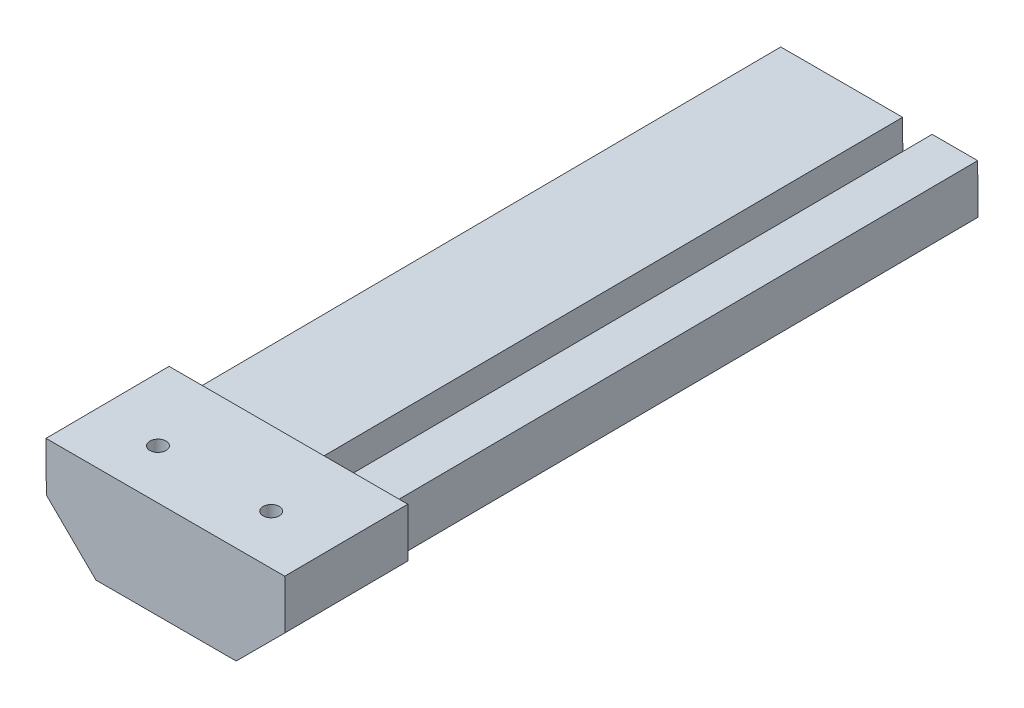
ISO-10303-21;
HEADER;
FILE_DESCRIPTION(('STEP AP214'),'2;1');
FILE_NAME('part.step','',(''),(''),'','','');
FILE_SCHEMA(('AUTOMOTIVE_DESIGN { 1 0 10303 214 1 1 1 1 }'));
ENDSEC;
DATA;
#1=APPLICATION_CONTEXT('core data for automotive mechanical design processes');
#2=APPLICATION_PROTOCOL_DEFINITION('international standard','automotive_design',2000,#1);
#3=PRODUCT_CONTEXT('',#1,'mechanical');
#4=PRODUCT('Part','Part','',(#3));
#5=PRODUCT_RELATED_PRODUCT_CATEGORY('part','',(#4));
#6=PRODUCT_DEFINITION_FORMATION('','',#4);
#7=PRODUCT_DEFINITION_CONTEXT('part definition',#1,'design');
#8=PRODUCT_DEFINITION('design','',#6,#7);
#9=PRODUCT_DEFINITION_SHAPE('','',#8);
#10=(LENGTH_UNIT() NAMED_UNIT(*) SI_UNIT(.MILLI.,.METRE.));
#11=(NAMED_UNIT(*) PLANE_ANGLE_UNIT() SI_UNIT($,.RADIAN.));
#12=(NAMED_UNIT(*) SI_UNIT($,.STERADIAN.) SOLID_ANGLE_UNIT());
#13=UNCERTAINTY_MEASURE_WITH_UNIT(LENGTH_MEASURE(1.E-05),#10,'distance_accuracy_value','');
#14=(GEOMETRIC_REPRESENTATION_CONTEXT(3) GLOBAL_UNCERTAINTY_ASSIGNED_CONTEXT((#13)) GLOBAL_UNIT_ASSIGNED_CONTEXT((#10,
#11,#12)) REPRESENTATION_CONTEXT('',''));
#15=CARTESIAN_POINT('',(0.,0.,0.));
#16=DIRECTION('',(0.,0.,1.));
#17=DIRECTION('',(1.,0.,0.));
#18=AXIS2_PLACEMENT_3D('',#15,#16,#17);
#19=CARTESIAN_POINT('',(12.1004516377429,78.5723158605039,-7605.18042246497));
#20=DIRECTION('',(0.,-0.999977218101321,-0.00675005765475416));
#21=DIRECTION('',(0.,0.00675005765475416,-0.999977218101321));
#22=AXIS2_PLACEMENT_3D('',#19,#20,#21);
#23=PLANE('',#22);
#24=DIRECTION('',(-1.,0.,0.));
#25=VECTOR('',#24,1.);
#26=CARTESIAN_POINT('',(12.1004516377429,78.7410673018727,-7630.1798529175));
#27=LINE('',#26,#25);
#28=CARTESIAN_POINT('',(60.6004516377429,78.7410673018727,-7630.1798529175));
#29=VERTEX_POINT('',#28);
#30=CARTESIAN_POINT('',(12.1004516377429,78.7410673018727,-7630.1798529175));
#31=VERTEX_POINT('',#30);
#32=EDGE_CURVE('E185',#29,#31,#27,.T.);
#33=ORIENTED_EDGE('',*,*,#32,.T.);
#34=DIRECTION('',(0.,0.00675005765475416,-0.999977218101321));
#35=VECTOR('',#34,1.);
#36=CARTESIAN_POINT('',(12.1004516377429,78.5723158605039,-7605.18042246497));
#37=LINE('',#36,#35);
#38=CARTESIAN_POINT('',(12.1004516377429,78.5723158605039,-7605.18042246497));
#39=VERTEX_POINT('',#38);
#40=EDGE_CURVE('E202',#39,#31,#37,.T.);
#41=ORIENTED_EDGE('',*,*,#40,.F.);
#42=DIRECTION('',(-1.,0.,0.));
#43=VECTOR('',#42,1.);
#44=CARTESIAN_POINT('',(12.1004516377429,78.5723158605039,-7605.18042246497));
#45=LINE('',#44,#43);
#46=CARTESIAN_POINT('',(60.6004516377429,78.5723158605039,-7605.18042246497));
#47=VERTEX_POINT('',#46);
#48=EDGE_CURVE('E607',#47,#39,#45,.T.);
#49=ORIENTED_EDGE('',*,*,#48,.F.);
#50=DIRECTION('',(0.,0.00675005765475416,-0.999977218101321));
#51=VECTOR('',#50,1.);
#52=CARTESIAN_POINT('',(60.6004516377429,78.5723158605039,-7605.18042246497));
#53=LINE('',#52,#51);
#54=EDGE_CURVE('E205',#47,#29,#53,.T.);
#55=ORIENTED_EDGE('',*,*,#54,.T.);
#56=EDGE_LOOP('',(#33,#41,#49,#55));
#57=FACE_BOUND('',#56,.T.);
#58=CARTESIAN_POINT('',(24.8504516377429,78.6398164370514,-7615.18019464598));
#59=DIRECTION('',(0.,0.999977218101321,0.00675005765475416));
#60=DIRECTION('',(0.,-0.00675005765475416,0.999977218101321));
#61=AXIS2_PLACEMENT_3D('',#58,#59,#60);
#62=CIRCLE('',#61,1.64999999999999);
#63=CARTESIAN_POINT('',(24.8504516377429,78.6286788419211,-7613.53023223612));
#64=VERTEX_POINT('',#63);
#65=EDGE_CURVE('E192',#64,#64,#62,.T.);
#66=ORIENTED_EDGE('',*,*,#65,.F.);
#67=EDGE_LOOP('',(#66));
#68=FACE_BOUND('',#67,.T.);
#69=CARTESIAN_POINT('',(47.8504516377429,78.6398164370514,-7615.18019464598));
#70=DIRECTION('',(0.,0.999977218101321,0.00675005765475416));
#71=DIRECTION('',(0.,-0.00675005765475416,0.999977218101321));
#72=AXIS2_PLACEMENT_3D('',#69,#70,#71);
#73=CIRCLE('',#72,1.64999999999998);
#74=CARTESIAN_POINT('',(47.8504516377429,78.6286788419211,-7613.53023223612));
#75=VERTEX_POINT('',#74);
#76=EDGE_CURVE('E172',#75,#75,#73,.T.);
#77=ORIENTED_EDGE('',*,*,#76,.F.);
#78=EDGE_LOOP('',(#77));
#79=FACE_BOUND('',#78,.T.);
#80=ADVANCED_FACE('F39',(#57,#68,#79),#23,.F.);
#81=CARTESIAN_POINT('',(1.94161929084201E-11,62.0514729036701,-7750.29524509861));
#82=DIRECTION('',(0.,0.999977218101321,0.00675005765475413));
#83=DIRECTION('',(0.,-0.00675005765475413,0.999977218101321));
#84=AXIS2_PLACEMENT_3D('',#81,#82,#83);
#85=PLANE('',#84);
#86=DIRECTION('',(-1.,0.,0.));
#87=VECTOR('',#86,1.);
#88=CARTESIAN_POINT('',(1.94439481678734E-11,61.2414659850996,-7630.29797892646));
#89=LINE('',#88,#87);
#90=CARTESIAN_POINT('',(44.3504516377429,61.2414659850996,-7630.29797892646));
#91=VERTEX_POINT('',#90);
#92=CARTESIAN_POINT('',(28.3504516377429,61.2414659850996,-7630.29797892646));
#93=VERTEX_POINT('',#92);
#94=EDGE_CURVE('E207',#91,#93,#89,.T.);
#95=ORIENTED_EDGE('',*,*,#94,.T.);
#96=DIRECTION('',(0.,-0.00675005765475413,0.999977218101321));
#97=VECTOR('',#96,1.);
#98=CARTESIAN_POINT('',(28.3504516377429,62.0514729036701,-7750.29524509861));
#99=LINE('',#98,#97);
#100=CARTESIAN_POINT('',(28.3504516377429,62.0514729036701,-7750.29524509861));
#101=VERTEX_POINT('',#100);
#102=EDGE_CURVE('E11',#101,#93,#99,.T.);
#103=ORIENTED_EDGE('',*,*,#102,.F.);
#104=DIRECTION('',(-1.,0.,0.));
#105=VECTOR('',#104,1.);
#106=CARTESIAN_POINT('',(1.94161929084201E-11,62.0514729036701,-7750.29524509861));
#107=LINE('',#106,#105);
#108=CARTESIAN_POINT('',(44.3504516377429,62.0514729036701,-7750.29524509861));
#109=VERTEX_POINT('',#108);
#110=EDGE_CURVE('E208',#109,#101,#107,.T.);
#111=ORIENTED_EDGE('',*,*,#110,.F.);
#112=DIRECTION('',(0.,-0.00675005765475413,0.999977218101321));
#113=VECTOR('',#112,1.);
#114=CARTESIAN_POINT('',(44.3504516377429,62.0514729036701,-7750.29524509861));
#115=LINE('',#114,#113);
#116=EDGE_CURVE('E43',#109,#91,#115,.T.);
#117=ORIENTED_EDGE('',*,*,#116,.T.);
#118=EDGE_LOOP('',(#95,#103,#111,#117));
#119=FACE_BOUND('',#118,.T.);
#120=ADVANCED_FACE('F41',(#119),#85,.F.);
#121=CARTESIAN_POINT('',(28.3504516377429,52.3165751807186,-7750.36095771657));
#122=DIRECTION('',(1.,0.,0.));
#123=DIRECTION('',(0.,1.,0.));
#124=AXIS2_PLACEMENT_3D('',#121,#122,#123);
#125=PLANE('',#124);
#126=DIRECTION('',(0.,0.999977218101321,0.00675005765476218));
#127=VECTOR('',#126,1.);
#128=CARTESIAN_POINT('',(28.3504516377429,51.5065682621481,-7630.36369154441));
#129=LINE('',#128,#127);
#130=CARTESIAN_POINT('',(28.3504516377429,66.2413520756062,-7630.26422863818));
#131=VERTEX_POINT('',#130);
#132=EDGE_CURVE('E212',#93,#131,#129,.T.);
#133=ORIENTED_EDGE('',*,*,#132,.T.);
#134=DIRECTION('',(0.,-0.00675005765475413,0.999977218101321));
#135=VECTOR('',#134,1.);
#136=CARTESIAN_POINT('',(28.3504516377429,67.0513589941767,-7750.26149481034));
#137=LINE('',#136,#135);
#138=CARTESIAN_POINT('',(28.3504516377429,67.0513589941767,-7750.26149481034));
#139=VERTEX_POINT('',#138);
#140=EDGE_CURVE('E48',#139,#131,#137,.T.);
#141=ORIENTED_EDGE('',*,*,#140,.F.);
#142=DIRECTION('',(0.,0.999977218101321,0.00675005765476218));
#143=VECTOR('',#142,1.);
#144=CARTESIAN_POINT('',(28.3504516377429,52.3165751807186,-7750.36095771657));
#145=LINE('',#144,#143);
#146=EDGE_CURVE('E232',#101,#139,#145,.T.);
#147=ORIENTED_EDGE('',*,*,#146,.F.);
#148=ORIENTED_EDGE('',*,*,#102,.T.);
#149=EDGE_LOOP('',(#133,#141,#147,#148));
#150=FACE_BOUND('',#149,.T.);
#151=ADVANCED_FACE('F342',(#150),#125,.F.);
#152=CARTESIAN_POINT('',(1.94173698614288E-11,67.0513589941767,-7750.26149481034));
#153=DIRECTION('',(0.,0.999977218101321,0.00675005765475413));
#154=DIRECTION('',(0.,-0.00675005765475413,0.999977218101321));
#155=AXIS2_PLACEMENT_3D('',#152,#153,#154);
#156=PLANE('',#155);
#157=DIRECTION('',(-1.,0.,0.));
#158=VECTOR('',#157,1.);
#159=CARTESIAN_POINT('',(1.94451251208821E-11,66.2413520756062,-7630.26422863818));
#160=LINE('',#159,#158);
#161=CARTESIAN_POINT('',(16.3504516377429,66.2413520756062,-7630.26422863818));
#162=VERTEX_POINT('',#161);
#163=EDGE_CURVE('E263',#131,#162,#160,.T.);
#164=ORIENTED_EDGE('',*,*,#163,.T.);
#165=DIRECTION('',(0.,-0.00675005765475413,0.999977218101321));
#166=VECTOR('',#165,1.);
#167=CARTESIAN_POINT('',(16.3504516377429,67.0513589941767,-7750.26149481034));
#168=LINE('',#167,#166);
#169=CARTESIAN_POINT('',(16.3504516377429,67.0513589941767,-7750.26149481034));
#170=VERTEX_POINT('',#169);
#171=EDGE_CURVE('E270',#170,#162,#168,.T.);
#172=ORIENTED_EDGE('',*,*,#171,.F.);
#173=DIRECTION('',(-1.,0.,0.));
#174=VECTOR('',#173,1.);
#175=CARTESIAN_POINT('',(1.94173698614288E-11,67.0513589941767,-7750.26149481034));
#176=LINE('',#175,#174);
#177=EDGE_CURVE('E230',#139,#170,#176,.T.);
#178=ORIENTED_EDGE('',*,*,#177,.F.);
#179=ORIENTED_EDGE('',*,*,#140,.T.);
#180=EDGE_LOOP('',(#164,#172,#178,#179));
#181=FACE_BOUND('',#180,.T.);
#182=ADVANCED_FACE('F338',(#181),#156,.F.);
#183=CARTESIAN_POINT('',(16.3504516377429,52.3165751807186,-7750.36095771657));
#184=DIRECTION('',(1.,0.,0.));
#185=DIRECTION('',(0.,1.,0.));
#186=AXIS2_PLACEMENT_3D('',#183,#184,#185);
#187=PLANE('',#186);
#188=DIRECTION('',(0.,0.999977218101321,0.00675005765476218));
#189=VECTOR('',#188,1.);
#190=CARTESIAN_POINT('',(16.3504516377429,51.5065682621481,-7630.36369154441));
#191=LINE('',#190,#189);
#192=CARTESIAN_POINT('',(16.3504516377429,76.2411242566194,-7630.19672806163));
#193=VERTEX_POINT('',#192);
#194=EDGE_CURVE('E260',#162,#193,#191,.T.);
#195=ORIENTED_EDGE('',*,*,#194,.T.);
#196=DIRECTION('',(0.,-0.00675005765475413,0.999977218101321));
#197=VECTOR('',#196,1.);
#198=CARTESIAN_POINT('',(16.3504516377429,77.0511311751899,-7750.19399423379));
#199=LINE('',#198,#197);
#200=CARTESIAN_POINT('',(16.3504516377429,77.0511311751899,-7750.19399423379));
#201=VERTEX_POINT('',#200);
#202=EDGE_CURVE('E273',#201,#193,#199,.T.);
#203=ORIENTED_EDGE('',*,*,#202,.F.);
#204=DIRECTION('',(0.,0.999977218101321,0.00675005765476218));
#205=VECTOR('',#204,1.);
#206=CARTESIAN_POINT('',(16.3504516377429,52.3165751807186,-7750.36095771657));
#207=LINE('',#206,#205);
#208=EDGE_CURVE('E228',#170,#201,#207,.T.);
#209=ORIENTED_EDGE('',*,*,#208,.F.);
#210=ORIENTED_EDGE('',*,*,#171,.T.);
#211=EDGE_LOOP('',(#195,#203,#209,#210));
#212=FACE_BOUND('',#211,.T.);
#213=ADVANCED_FACE('F335',(#212),#187,.F.);
#214=CARTESIAN_POINT('',(1.94197237674463E-11,77.0511311751899,-7750.19399423379));
#215=DIRECTION('',(0.,-0.999977218101321,-0.00675005765475413));
#216=DIRECTION('',(0.,0.00675005765475413,-0.999977218101321));
#217=AXIS2_PLACEMENT_3D('',#214,#215,#216);
#218=PLANE('',#217);
#219=DIRECTION('',(1.,0.,0.));
#220=VECTOR('',#219,1.);
#221=CARTESIAN_POINT('',(1.94474790268995E-11,76.2411242566194,-7630.19672806163));
#222=LINE('',#221,#220);
#223=CARTESIAN_POINT('',(41.1004008377429,76.2411242566194,-7630.19672806163));
#224=VERTEX_POINT('',#223);
#225=EDGE_CURVE('E257',#193,#224,#222,.T.);
#226=ORIENTED_EDGE('',*,*,#225,.T.);
#227=DIRECTION('',(0.,-0.00675005765475413,0.999977218101321));
#228=VECTOR('',#227,1.);
#229=CARTESIAN_POINT('',(41.1004008377429,77.0511311751899,-7750.19399423379));
#230=LINE('',#229,#228);
#231=CARTESIAN_POINT('',(41.1004008377429,77.0511311751899,-7750.19399423379));
#232=VERTEX_POINT('',#231);
#233=EDGE_CURVE('E276',#232,#224,#230,.T.);
#234=ORIENTED_EDGE('',*,*,#233,.F.);
#235=DIRECTION('',(1.,0.,0.));
#236=VECTOR('',#235,1.);
#237=CARTESIAN_POINT('',(1.94197237674463E-11,77.0511311751899,-7750.19399423379));
#238=LINE('',#237,#236);
#239=EDGE_CURVE('E226',#201,#232,#238,.T.);
#240=ORIENTED_EDGE('',*,*,#239,.F.);
#241=ORIENTED_EDGE('',*,*,#202,.T.);
#242=EDGE_LOOP('',(#226,#234,#240,#241));
#243=FACE_BOUND('',#242,.T.);
#244=ADVANCED_FACE('F330',(#243),#218,.F.);
#245=CARTESIAN_POINT('',(41.1004008377414,52.316575180716,-7750.36095771657));
#246=DIRECTION('',(-1.,0.,0.));
#247=DIRECTION('',(0.,-1.,0.));
#248=AXIS2_PLACEMENT_3D('',#245,#246,#247);
#249=PLANE('',#248);
#250=DIRECTION('',(0.,-0.999977218101321,-0.00675005765476218));
#251=VECTOR('',#250,1.);
#252=CARTESIAN_POINT('',(41.1004008377414,51.5065682621455,-7630.36369154441));
#253=LINE('',#252,#251);
#254=CARTESIAN_POINT('',(41.1004008377425,69.2412837299107,-7630.24397846522));
#255=VERTEX_POINT('',#254);
#256=EDGE_CURVE('E254',#224,#255,#253,.T.);
#257=ORIENTED_EDGE('',*,*,#256,.T.);
#258=DIRECTION('',(0.,-0.00675005765475413,0.999977218101321));
#259=VECTOR('',#258,1.);
#260=CARTESIAN_POINT('',(41.1004008377425,70.0512906484812,-7750.24124463738));
#261=LINE('',#260,#259);
#262=CARTESIAN_POINT('',(41.1004008377425,70.0512906484812,-7750.24124463738));
#263=VERTEX_POINT('',#262);
#264=EDGE_CURVE('E279',#263,#255,#261,.T.);
#265=ORIENTED_EDGE('',*,*,#264,.F.);
#266=DIRECTION('',(0.,-0.999977218101321,-0.00675005765476218));
#267=VECTOR('',#266,1.);
#268=CARTESIAN_POINT('',(41.1004008377414,52.316575180716,-7750.36095771657));
#269=LINE('',#268,#267);
#270=EDGE_CURVE('E224',#232,#263,#269,.T.);
#271=ORIENTED_EDGE('',*,*,#270,.F.);
#272=ORIENTED_EDGE('',*,*,#233,.T.);
#273=EDGE_LOOP('',(#257,#265,#271,#272));
#274=FACE_BOUND('',#273,.T.);
#275=ADVANCED_FACE('F327',(#274),#249,.F.);
#276=CARTESIAN_POINT('',(1.94139013527812E-11,70.0512906484812,-7750.24124463738));
#277=DIRECTION('',(0.,-0.999977218101321,-0.00675005765475413));
#278=DIRECTION('',(0.,0.00675005765475413,-0.999977218101321));
#279=AXIS2_PLACEMENT_3D('',#276,#277,#278);
#280=PLANE('',#279);
#281=DIRECTION('',(1.,0.,0.));
#282=VECTOR('',#281,1.);
#283=CARTESIAN_POINT('',(1.94416566122344E-11,69.2412837299107,-7630.24397846522));
#284=LINE('',#283,#282);
#285=CARTESIAN_POINT('',(47.1004008377425,69.2412837299107,-7630.24397846522));
#286=VERTEX_POINT('',#285);
#287=EDGE_CURVE('E251',#255,#286,#284,.T.);
#288=ORIENTED_EDGE('',*,*,#287,.T.);
#289=DIRECTION('',(0.,-0.00675005765475413,0.999977218101321));
#290=VECTOR('',#289,1.);
#291=CARTESIAN_POINT('',(47.1004008377425,70.0512906484812,-7750.24124463738));
#292=LINE('',#291,#290);
#293=CARTESIAN_POINT('',(47.1004008377425,70.0512906484812,-7750.24124463738));
#294=VERTEX_POINT('',#293);
#295=EDGE_CURVE('E282',#294,#286,#292,.T.);
#296=ORIENTED_EDGE('',*,*,#295,.F.);
#297=DIRECTION('',(1.,0.,0.));
#298=VECTOR('',#297,1.);
#299=CARTESIAN_POINT('',(1.94139013527812E-11,70.0512906484812,-7750.24124463738));
#300=LINE('',#299,#298);
#301=EDGE_CURVE('E222',#263,#294,#300,.T.);
#302=ORIENTED_EDGE('',*,*,#301,.F.);
#303=ORIENTED_EDGE('',*,*,#264,.T.);
#304=EDGE_LOOP('',(#288,#296,#302,#303));
#305=FACE_BOUND('',#304,.T.);
#306=ADVANCED_FACE('F322',(#305),#280,.F.);
#307=CARTESIAN_POINT('',(47.1004008377429,52.3165751807186,-7750.36095771657));
#308=DIRECTION('',(1.,0.,0.));
#309=DIRECTION('',(0.,1.,0.));
#310=AXIS2_PLACEMENT_3D('',#307,#308,#309);
#311=PLANE('',#310);
#312=DIRECTION('',(0.,0.999977218101321,0.00675005765476218));
#313=VECTOR('',#312,1.);
#314=CARTESIAN_POINT('',(47.1004008377429,51.5065682621481,-7630.36369154441));
#315=LINE('',#314,#313);
#316=CARTESIAN_POINT('',(47.1004008377429,76.2411242566194,-7630.19672806163));
#317=VERTEX_POINT('',#316);
#318=EDGE_CURVE('E248',#286,#317,#315,.T.);
#319=ORIENTED_EDGE('',*,*,#318,.T.);
#320=DIRECTION('',(0.,-0.00675005765475413,0.999977218101321));
#321=VECTOR('',#320,1.);
#322=CARTESIAN_POINT('',(47.1004008377429,77.0511311751899,-7750.19399423379));
#323=LINE('',#322,#321);
#324=CARTESIAN_POINT('',(47.1004008377429,77.0511311751899,-7750.19399423379));
#325=VERTEX_POINT('',#324);
#326=EDGE_CURVE('E285',#325,#317,#323,.T.);
#327=ORIENTED_EDGE('',*,*,#326,.F.);
#328=DIRECTION('',(0.,0.999977218101321,0.00675005765476218));
#329=VECTOR('',#328,1.);
#330=CARTESIAN_POINT('',(47.1004008377429,52.3165751807186,-7750.36095771657));
#331=LINE('',#330,#329);
#332=EDGE_CURVE('E220',#294,#325,#331,.T.);
#333=ORIENTED_EDGE('',*,*,#332,.F.);
#334=ORIENTED_EDGE('',*,*,#295,.T.);
#335=EDGE_LOOP('',(#319,#327,#333,#334));
#336=FACE_BOUND('',#335,.T.);
#337=ADVANCED_FACE('F319',(#336),#311,.F.);
#338=CARTESIAN_POINT('',(1.94197237674463E-11,77.0511311751899,-7750.19399423379));
#339=DIRECTION('',(0.,-0.999977218101321,-0.00675005765475413));
#340=DIRECTION('',(0.,0.00675005765475413,-0.999977218101321));
#341=AXIS2_PLACEMENT_3D('',#338,#339,#340);
#342=PLANE('',#341);
#343=DIRECTION('',(1.,0.,0.));
#344=VECTOR('',#343,1.);
#345=CARTESIAN_POINT('',(1.94474790268995E-11,76.2411242566194,-7630.19672806163));
#346=LINE('',#345,#344);
#347=CARTESIAN_POINT('',(56.3504516377429,76.2411242566194,-7630.19672806163));
#348=VERTEX_POINT('',#347);
#349=EDGE_CURVE('E245',#317,#348,#346,.T.);
#350=ORIENTED_EDGE('',*,*,#349,.T.);
#351=DIRECTION('',(0.,-0.00675005765475413,0.999977218101321));
#352=VECTOR('',#351,1.);
#353=CARTESIAN_POINT('',(56.3504516377429,77.0511311751899,-7750.19399423379));
#354=LINE('',#353,#352);
#355=CARTESIAN_POINT('',(56.3504516377429,77.0511311751899,-7750.19399423379));
#356=VERTEX_POINT('',#355);
#357=EDGE_CURVE('E288',#356,#348,#354,.T.);
#358=ORIENTED_EDGE('',*,*,#357,.F.);
#359=DIRECTION('',(1.,0.,0.));
#360=VECTOR('',#359,1.);
#361=CARTESIAN_POINT('',(1.94197237674463E-11,77.0511311751899,-7750.19399423379));
#362=LINE('',#361,#360);
#363=EDGE_CURVE('E218',#325,#356,#362,.T.);
#364=ORIENTED_EDGE('',*,*,#363,.F.);
#365=ORIENTED_EDGE('',*,*,#326,.T.);
#366=EDGE_LOOP('',(#350,#358,#364,#365));
#367=FACE_BOUND('',#366,.T.);
#368=ADVANCED_FACE('F314',(#367),#342,.F.);
#369=CARTESIAN_POINT('',(56.3504516377429,52.3165751807186,-7750.36095771657));
#370=DIRECTION('',(-1.,0.,0.));
#371=DIRECTION('',(0.,-1.,0.));
#372=AXIS2_PLACEMENT_3D('',#369,#370,#371);
#373=PLANE('',#372);
#374=DIRECTION('',(0.,-0.999977218101321,-0.00675005765476218));
#375=VECTOR('',#374,1.);
#376=CARTESIAN_POINT('',(56.3504516377429,51.5065682621481,-7630.36369154441));
#377=LINE('',#376,#375);
#378=CARTESIAN_POINT('',(56.3504516377429,66.2413520756062,-7630.26422863818));
#379=VERTEX_POINT('',#378);
#380=EDGE_CURVE('E242',#348,#379,#377,.T.);
#381=ORIENTED_EDGE('',*,*,#380,.T.);
#382=DIRECTION('',(0.,-0.00675005765475413,0.999977218101321));
#383=VECTOR('',#382,1.);
#384=CARTESIAN_POINT('',(56.3504516377429,67.0513589941767,-7750.26149481034));
#385=LINE('',#384,#383);
#386=CARTESIAN_POINT('',(56.3504516377429,67.0513589941767,-7750.26149481034));
#387=VERTEX_POINT('',#386);
#388=EDGE_CURVE('E291',#387,#379,#385,.T.);
#389=ORIENTED_EDGE('',*,*,#388,.F.);
#390=DIRECTION('',(0.,-0.999977218101321,-0.00675005765476218));
#391=VECTOR('',#390,1.);
#392=CARTESIAN_POINT('',(56.3504516377429,52.3165751807186,-7750.36095771657));
#393=LINE('',#392,#391);
#394=EDGE_CURVE('E216',#356,#387,#393,.T.);
#395=ORIENTED_EDGE('',*,*,#394,.F.);
#396=ORIENTED_EDGE('',*,*,#357,.T.);
#397=EDGE_LOOP('',(#381,#389,#395,#396));
#398=FACE_BOUND('',#397,.T.);
#399=ADVANCED_FACE('F311',(#398),#373,.F.);
#400=CARTESIAN_POINT('',(1.94173698614288E-11,67.0513589941767,-7750.26149481034));
#401=DIRECTION('',(0.,0.999977218101321,0.00675005765475413));
#402=DIRECTION('',(0.,-0.00675005765475413,0.999977218101321));
#403=AXIS2_PLACEMENT_3D('',#400,#401,#402);
#404=PLANE('',#403);
#405=DIRECTION('',(-1.,0.,0.));
#406=VECTOR('',#405,1.);
#407=CARTESIAN_POINT('',(1.94451251208821E-11,66.2413520756062,-7630.26422863818));
#408=LINE('',#407,#406);
#409=CARTESIAN_POINT('',(44.3504516377429,66.2413520756062,-7630.26422863818));
#410=VERTEX_POINT('',#409);
#411=EDGE_CURVE('E239',#379,#410,#408,.T.);
#412=ORIENTED_EDGE('',*,*,#411,.T.);
#413=DIRECTION('',(0.,-0.00675005765475413,0.999977218101321));
#414=VECTOR('',#413,1.);
#415=CARTESIAN_POINT('',(44.3504516377429,67.0513589941767,-7750.26149481034));
#416=LINE('',#415,#414);
#417=CARTESIAN_POINT('',(44.3504516377429,67.0513589941767,-7750.26149481034));
#418=VERTEX_POINT('',#417);
#419=EDGE_CURVE('E293',#418,#410,#416,.T.);
#420=ORIENTED_EDGE('',*,*,#419,.F.);
#421=DIRECTION('',(-1.,0.,0.));
#422=VECTOR('',#421,1.);
#423=CARTESIAN_POINT('',(1.94173698614288E-11,67.0513589941767,-7750.26149481034));
#424=LINE('',#423,#422);
#425=EDGE_CURVE('E214',#387,#418,#424,.T.);
#426=ORIENTED_EDGE('',*,*,#425,.F.);
#427=ORIENTED_EDGE('',*,*,#388,.T.);
#428=EDGE_LOOP('',(#412,#420,#426,#427));
#429=FACE_BOUND('',#428,.T.);
#430=ADVANCED_FACE('F306',(#429),#404,.F.);
#431=CARTESIAN_POINT('',(44.3504516377429,52.3165751807186,-7750.36095771657));
#432=DIRECTION('',(-1.,0.,0.));
#433=DIRECTION('',(0.,-1.,0.));
#434=AXIS2_PLACEMENT_3D('',#431,#432,#433);
#435=PLANE('',#434);
#436=DIRECTION('',(0.,-0.999977218101321,-0.00675005765476218));
#437=VECTOR('',#436,1.);
#438=CARTESIAN_POINT('',(44.3504516377429,51.5065682621481,-7630.36369154441));
#439=LINE('',#438,#437);
#440=EDGE_CURVE('E236',#410,#91,#439,.T.);
#441=ORIENTED_EDGE('',*,*,#440,.T.);
#442=ORIENTED_EDGE('',*,*,#116,.F.);
#443=DIRECTION('',(0.,-0.999977218101321,-0.00675005765476218));
#444=VECTOR('',#443,1.);
#445=CARTESIAN_POINT('',(44.3504516377429,52.3165751807186,-7750.36095771657));
#446=LINE('',#445,#444);
#447=EDGE_CURVE('E211',#418,#109,#446,.T.);
#448=ORIENTED_EDGE('',*,*,#447,.F.);
#449=ORIENTED_EDGE('',*,*,#419,.T.);
#450=EDGE_LOOP('',(#441,#442,#448,#449));
#451=FACE_BOUND('',#450,.T.);
#452=ADVANCED_FACE('F303',(#451),#435,.F.);
#453=CARTESIAN_POINT('',(1.94139013527812E-11,52.3165751807187,-7750.36095771657));
#454=DIRECTION('',(0.,-0.00675005765476218,0.999977218101321));
#455=DIRECTION('',(0.,-0.999977218101321,-0.00675005765476218));
#456=AXIS2_PLACEMENT_3D('',#453,#454,#455);
#457=PLANE('',#456);
#458=ORIENTED_EDGE('',*,*,#110,.T.);
#459=ORIENTED_EDGE('',*,*,#146,.T.);
#460=ORIENTED_EDGE('',*,*,#177,.T.);
#461=ORIENTED_EDGE('',*,*,#208,.T.);
#462=ORIENTED_EDGE('',*,*,#239,.T.);
#463=ORIENTED_EDGE('',*,*,#270,.T.);
#464=ORIENTED_EDGE('',*,*,#301,.T.);
#465=ORIENTED_EDGE('',*,*,#332,.T.);
#466=ORIENTED_EDGE('',*,*,#363,.T.);
#467=ORIENTED_EDGE('',*,*,#394,.T.);
#468=ORIENTED_EDGE('',*,*,#425,.T.);
#469=ORIENTED_EDGE('',*,*,#447,.T.);
#470=EDGE_LOOP('',(#458,#459,#460,#461,#462,#463,#464,#465,#466,#467,#468,#469));
#471=FACE_BOUND('',#470,.T.);
#472=ADVANCED_FACE('F344',(#471),#457,.F.);
#473=CARTESIAN_POINT('',(60.6004516377429,78.5723158605039,-7605.18042246497));
#474=DIRECTION('',(-1.,0.,0.));
#475=DIRECTION('',(0.,0.,1.));
#476=AXIS2_PLACEMENT_3D('',#473,#474,#475);
#477=PLANE('',#476);
#478=DIRECTION('',(0.,0.999977218101321,0.00675005765473635));
#479=VECTOR('',#478,1.);
#480=CARTESIAN_POINT('',(60.6004516377429,78.5723158605039,-7605.18042246497));
#481=LINE('',#480,#479);
#482=CARTESIAN_POINT('',(60.6004516377429,68.5725436794907,-7605.24792304152));
#483=VERTEX_POINT('',#482);
#484=EDGE_CURVE('E180',#483,#47,#481,.T.);
#485=ORIENTED_EDGE('',*,*,#484,.F.);
#486=DIRECTION('',(0.,-0.00675005765473635,0.999977218101321));
#487=VECTOR('',#486,1.);
#488=CARTESIAN_POINT('',(60.6004516377429,69.5520692675295,-7750.35827952845));
#489=LINE('',#488,#487);
#490=CARTESIAN_POINT('',(60.6004516377429,68.741295120859,-7630.24735349405));
#491=VERTEX_POINT('',#490);
#492=EDGE_CURVE('E166',#491,#483,#489,.T.);
#493=ORIENTED_EDGE('',*,*,#492,.F.);
#494=DIRECTION('',(0.,0.999977218101321,0.00675005765473635));
#495=VECTOR('',#494,1.);
#496=CARTESIAN_POINT('',(60.6004516377429,78.7410673018727,-7630.1798529175));
#497=LINE('',#496,#495);
#498=EDGE_CURVE('E178',#491,#29,#497,.T.);
#499=ORIENTED_EDGE('',*,*,#498,.T.);
#500=ORIENTED_EDGE('',*,*,#54,.F.);
#501=EDGE_LOOP('',(#485,#493,#499,#500));
#502=FACE_BOUND('',#501,.T.);
#503=ADVANCED_FACE('F176',(#502),#477,.F.);
#504=CARTESIAN_POINT('',(12.1004516377429,78.5723158605039,-7605.18042246497));
#505=DIRECTION('',(1.,0.,0.));
#506=DIRECTION('',(0.,0.,-1.));
#507=AXIS2_PLACEMENT_3D('',#504,#505,#506);
#508=PLANE('',#507);
#509=DIRECTION('',(0.,-0.999977218101321,-0.00675005765473635));
#510=VECTOR('',#509,1.);
#511=CARTESIAN_POINT('',(12.1004516377429,78.7410673018727,-7630.1798529175));
#512=LINE('',#511,#510);
#513=CARTESIAN_POINT('',(12.1004516377429,68.7412951208591,-7630.24735349405));
#514=VERTEX_POINT('',#513);
#515=EDGE_CURVE('E189',#31,#514,#512,.T.);
#516=ORIENTED_EDGE('',*,*,#515,.T.);
#517=DIRECTION('',(0.,-0.00675005765473635,0.999977218101321));
#518=VECTOR('',#517,1.);
#519=CARTESIAN_POINT('',(12.1004516377429,69.5520692675295,-7750.35827952845));
#520=LINE('',#519,#518);
#521=CARTESIAN_POINT('',(12.1004516377429,68.5725436794907,-7605.24792304152));
#522=VERTEX_POINT('',#521);
#523=EDGE_CURVE('E56',#514,#522,#520,.T.);
#524=ORIENTED_EDGE('',*,*,#523,.T.);
#525=DIRECTION('',(0.,-0.999977218101321,-0.00675005765473635));
#526=VECTOR('',#525,1.);
#527=CARTESIAN_POINT('',(12.1004516377429,78.5723158605039,-7605.18042246497));
#528=LINE('',#527,#526);
#529=EDGE_CURVE('E608',#39,#522,#528,.T.);
#530=ORIENTED_EDGE('',*,*,#529,.F.);
#531=ORIENTED_EDGE('',*,*,#40,.T.);
#532=EDGE_LOOP('',(#516,#524,#530,#531));
#533=FACE_BOUND('',#532,.T.);
#534=ADVANCED_FACE('F351',(#533),#508,.F.);
#535=CARTESIAN_POINT('',(12.1004516377429,58.5727714984774,-7605.31542361806));
#536=DIRECTION('',(0.,0.999977218101321,0.00675005765475416));
#537=DIRECTION('',(0.,-0.00675005765475416,0.999977218101321));
#538=AXIS2_PLACEMENT_3D('',#535,#536,#537);
#539=PLANE('',#538);
#540=CARTESIAN_POINT('',(47.8504516377429,58.640272075025,-7615.31519579908));
#541=DIRECTION('',(0.,0.999977218101321,0.00675005765475416));
#542=DIRECTION('',(0.,-0.00675005765475416,0.999977218101321));
#543=AXIS2_PLACEMENT_3D('',#540,#541,#542);
#544=CIRCLE('',#543,1.64999999999999);
#545=CARTESIAN_POINT('',(47.8504516377429,58.6291344798946,-7613.66523338921));
#546=VERTEX_POINT('',#545);
#547=EDGE_CURVE('E601',#546,#546,#544,.T.);
#548=ORIENTED_EDGE('',*,*,#547,.T.);
#549=EDGE_LOOP('',(#548));
#550=FACE_BOUND('',#549,.T.);
#551=CARTESIAN_POINT('',(24.8504516377429,58.640272075025,-7615.31519579908));
#552=DIRECTION('',(0.,0.999977218101321,0.00675005765475416));
#553=DIRECTION('',(0.,-0.00675005765475416,0.999977218101321));
#554=AXIS2_PLACEMENT_3D('',#551,#552,#553);
#555=CIRCLE('',#554,1.64999999999999);
#556=CARTESIAN_POINT('',(24.8504516377429,58.6291344798946,-7613.66523338921));
#557=VERTEX_POINT('',#556);
#558=EDGE_CURVE('E187',#557,#557,#555,.T.);
#559=ORIENTED_EDGE('',*,*,#558,.T.);
#560=EDGE_LOOP('',(#559));
#561=FACE_BOUND('',#560,.T.);
#562=DIRECTION('',(1.,0.,0.));
#563=VECTOR('',#562,1.);
#564=CARTESIAN_POINT('',(12.1004516377429,58.7415229398463,-7630.3148540706));
#565=LINE('',#564,#563);
#566=CARTESIAN_POINT('',(22.1004516377432,58.7415229398459,-7630.3148540706));
#567=VERTEX_POINT('',#566);
#568=CARTESIAN_POINT('',(50.6004516377433,58.7415229398463,-7630.3148540706));
#569=VERTEX_POINT('',#568);
#570=EDGE_CURVE('E200',#567,#569,#565,.T.);
#571=ORIENTED_EDGE('',*,*,#570,.T.);
#572=DIRECTION('',(0.,-0.00675005765473635,0.999977218101321));
#573=VECTOR('',#572,1.);
#574=CARTESIAN_POINT('',(50.6004516377428,59.5522970865163,-7750.425780105));
#575=LINE('',#574,#573);
#576=CARTESIAN_POINT('',(50.6004516377428,58.5727714984775,-7605.31542361807));
#577=VERTEX_POINT('',#576);
#578=EDGE_CURVE('E64',#569,#577,#575,.T.);
#579=ORIENTED_EDGE('',*,*,#578,.T.);
#580=DIRECTION('',(1.,0.,0.));
#581=VECTOR('',#580,1.);
#582=CARTESIAN_POINT('',(12.1004516377429,58.5727714984774,-7605.31542361806));
#583=LINE('',#582,#581);
#584=CARTESIAN_POINT('',(22.1004516377432,58.5727714984775,-7605.31542361807));
#585=VERTEX_POINT('',#584);
#586=EDGE_CURVE('E195',#585,#577,#583,.T.);
#587=ORIENTED_EDGE('',*,*,#586,.F.);
#588=DIRECTION('',(0.,-0.00675005765473635,0.999977218101321));
#589=VECTOR('',#588,1.);
#590=CARTESIAN_POINT('',(22.1004516377432,59.5522970865163,-7750.425780105));
#591=LINE('',#590,#589);
#592=EDGE_CURVE('E588',#567,#585,#591,.T.);
#593=ORIENTED_EDGE('',*,*,#592,.F.);
#594=EDGE_LOOP('',(#571,#579,#587,#593));
#595=FACE_BOUND('',#594,.T.);
#596=ADVANCED_FACE('F364',(#550,#561,#595),#539,.F.);
#597=CARTESIAN_POINT('',(0.,51.3378168205822,-7605.36426109188));
#598=DIRECTION('',(0.,-0.00675005765473635,0.999977218101321));
#599=DIRECTION('',(0.,-0.999977218101321,-0.00675005765473635));
#600=AXIS2_PLACEMENT_3D('',#597,#598,#599);
#601=PLANE('',#600);
#602=DIRECTION('',(-0.707106781186551,-0.7070906719515,-0.00477301154109561));
#603=VECTOR('',#602,1.);
#604=CARTESIAN_POINT('',(60.6004516377429,68.5725436794907,-7605.24792304152));
#605=LINE('',#604,#603);
#606=EDGE_CURVE('E181',#483,#577,#605,.T.);
#607=ORIENTED_EDGE('',*,*,#606,.F.);
#608=ORIENTED_EDGE('',*,*,#484,.T.);
#609=ORIENTED_EDGE('',*,*,#48,.T.);
#610=ORIENTED_EDGE('',*,*,#529,.T.);
#611=DIRECTION('',(-0.707106781186556,0.707090671951495,0.00477301154109558));
#612=VECTOR('',#611,1.);
#613=CARTESIAN_POINT('',(12.1004516377429,68.5725436794907,-7605.24792304152));
#614=LINE('',#613,#612);
#615=EDGE_CURVE('E590',#585,#522,#614,.T.);
#616=ORIENTED_EDGE('',*,*,#615,.F.);
#617=ORIENTED_EDGE('',*,*,#586,.T.);
#618=EDGE_LOOP('',(#607,#608,#609,#610,#616,#617));
#619=FACE_BOUND('',#618,.T.);
#620=ADVANCED_FACE('F368',(#619),#601,.T.);
#621=CARTESIAN_POINT('',(0.,51.5065682619511,-7630.36369154441));
#622=DIRECTION('',(0.,-0.00675005765473635,0.999977218101321));
#623=DIRECTION('',(0.,-0.999977218101321,-0.00675005765473635));
#624=AXIS2_PLACEMENT_3D('',#621,#622,#623);
#625=PLANE('',#624);
#626=ORIENTED_EDGE('',*,*,#94,.F.);
#627=ORIENTED_EDGE('',*,*,#440,.F.);
#628=ORIENTED_EDGE('',*,*,#411,.F.);
#629=ORIENTED_EDGE('',*,*,#380,.F.);
#630=ORIENTED_EDGE('',*,*,#349,.F.);
#631=ORIENTED_EDGE('',*,*,#318,.F.);
#632=ORIENTED_EDGE('',*,*,#287,.F.);
#633=ORIENTED_EDGE('',*,*,#256,.F.);
#634=ORIENTED_EDGE('',*,*,#225,.F.);
#635=ORIENTED_EDGE('',*,*,#194,.F.);
#636=ORIENTED_EDGE('',*,*,#163,.F.);
#637=ORIENTED_EDGE('',*,*,#132,.F.);
#638=EDGE_LOOP('',(#626,#627,#628,#629,#630,#631,#632,#633,#634,#635,#636,#637));
#639=FACE_BOUND('',#638,.T.);
#640=ORIENTED_EDGE('',*,*,#498,.F.);
#641=DIRECTION('',(0.707106781186551,0.7070906719515,0.00477301154106421));
#642=VECTOR('',#641,1.);
#643=CARTESIAN_POINT('',(60.6004516377429,68.7412951208591,-7630.24735349405));
#644=LINE('',#643,#642);
#645=EDGE_CURVE('E163',#569,#491,#644,.T.);
#646=ORIENTED_EDGE('',*,*,#645,.F.);
#647=ORIENTED_EDGE('',*,*,#570,.F.);
#648=DIRECTION('',(0.707106781186556,-0.707090671951495,-0.00477301154106418));
#649=VECTOR('',#648,1.);
#650=CARTESIAN_POINT('',(12.1004516377429,68.7412951208591,-7630.24735349405));
#651=LINE('',#650,#649);
#652=EDGE_CURVE('E586',#514,#567,#651,.T.);
#653=ORIENTED_EDGE('',*,*,#652,.F.);
#654=ORIENTED_EDGE('',*,*,#515,.F.);
#655=ORIENTED_EDGE('',*,*,#32,.F.);
#656=EDGE_LOOP('',(#640,#646,#647,#653,#654,#655));
#657=FACE_BOUND('',#656,.T.);
#658=ADVANCED_FACE('F183',(#639,#657),#625,.F.);
#659=CARTESIAN_POINT('',(24.8504516377429,78.6398164370514,-7615.18019464598));
#660=DIRECTION('',(0.,0.999977218101321,0.00675005765475416));
#661=DIRECTION('',(0.,-0.00675005765475416,0.999977218101321));
#662=AXIS2_PLACEMENT_3D('',#659,#660,#661);
#663=CYLINDRICAL_SURFACE('',#662,1.64999999999999);
#664=CARTESIAN_POINT('',(24.8504516377429,58.6291344798946,-7613.66523338921));
#665=CARTESIAN_POINT('',(24.8504516377429,58.8374630669991,-7613.6638271272));
#666=CARTESIAN_POINT('',(24.8504516377429,59.0457916541035,-7613.66242086519));
#667=CARTESIAN_POINT('',(24.8504516377429,59.4624488283124,-7613.65960834117));
#668=CARTESIAN_POINT('',(24.8504516377429,59.6707774154169,-7613.65820207915));
#669=CARTESIAN_POINT('',(24.8504516377429,60.0874345896257,-7613.65538955513));
#670=CARTESIAN_POINT('',(24.8504516377429,60.2957631767302,-7613.65398329312));
#671=CARTESIAN_POINT('',(24.8504516377429,60.7124203509391,-7613.6511707691));
#672=CARTESIAN_POINT('',(24.8504516377429,60.9207489380435,-7613.64976450709));
#673=CARTESIAN_POINT('',(24.8504516377429,61.3374061122524,-7613.64695198306));
#674=CARTESIAN_POINT('',(24.8504516377429,61.5457346993568,-7613.64554572105));
#675=CARTESIAN_POINT('',(24.8504516377429,61.9623918735657,-7613.64273319703));
#676=CARTESIAN_POINT('',(24.8504516377429,62.1707204606702,-7613.64132693502));
#677=CARTESIAN_POINT('',(24.8504516377429,62.587377634879,-7613.63851441099));
#678=CARTESIAN_POINT('',(24.8504516377429,62.7957062219835,-7613.63710814898));
#679=CARTESIAN_POINT('',(24.8504516377429,63.2123633961924,-7613.63429562496));
#680=CARTESIAN_POINT('',(24.8504516377429,63.4206919832968,-7613.63288936295));
#681=CARTESIAN_POINT('',(24.8504516377429,63.8373491575057,-7613.63007683893));
#682=CARTESIAN_POINT('',(24.8504516377429,64.0456777446101,-7613.62867057692));
#683=CARTESIAN_POINT('',(24.8504516377429,64.462334918819,-7613.62585805289));
#684=CARTESIAN_POINT('',(24.8504516377429,64.6706635059235,-7613.62445179088));
#685=CARTESIAN_POINT('',(24.8504516377429,65.0873206801323,-7613.62163926686));
#686=CARTESIAN_POINT('',(24.8504516377429,65.2956492672368,-7613.62023300485));
#687=CARTESIAN_POINT('',(24.8504516377429,65.7123064414457,-7613.61742048082));
#688=CARTESIAN_POINT('',(24.8504516377429,65.9206350285501,-7613.61601421881));
#689=CARTESIAN_POINT('',(24.8504516377429,66.337292202759,-7613.61320169479));
#690=CARTESIAN_POINT('',(24.8504516377429,66.5456207898634,-7613.61179543278));
#691=CARTESIAN_POINT('',(24.8504516377429,66.9622779640723,-7613.60898290876));
#692=CARTESIAN_POINT('',(24.8504516377429,67.1706065511768,-7613.60757664674));
#693=CARTESIAN_POINT('',(24.8504516377429,67.5872637253857,-7613.60476412272));
#694=CARTESIAN_POINT('',(24.8504516377429,67.7955923124901,-7613.60335786071));
#695=CARTESIAN_POINT('',(24.8504516377429,68.212249486699,-7613.60054533669));
#696=CARTESIAN_POINT('',(24.8504516377429,68.4205780738034,-7613.59913907468));
#697=CARTESIAN_POINT('',(24.8504516377429,68.8372352480123,-7613.59632655065));
#698=CARTESIAN_POINT('',(24.8504516377429,69.0455638351167,-7613.59492028864));
#699=CARTESIAN_POINT('',(24.8504516377429,69.4622210093256,-7613.59210776462));
#700=CARTESIAN_POINT('',(24.8504516377429,69.6705495964301,-7613.59070150261));
#701=CARTESIAN_POINT('',(24.8504516377429,70.087206770639,-7613.58788897858));
#702=CARTESIAN_POINT('',(24.8504516377429,70.2955353577434,-7613.58648271657));
#703=CARTESIAN_POINT('',(24.8504516377429,70.7121925319523,-7613.58367019255));
#704=CARTESIAN_POINT('',(24.8504516377429,70.9205211190567,-7613.58226393054));
#705=CARTESIAN_POINT('',(24.8504516377429,71.3371782932656,-7613.57945140652));
#706=CARTESIAN_POINT('',(24.8504516377429,71.5455068803701,-7613.5780451445));
#707=CARTESIAN_POINT('',(24.8504516377429,71.9621640545789,-7613.57523262048));
#708=CARTESIAN_POINT('',(24.8504516377429,72.1704926416834,-7613.57382635847));
#709=CARTESIAN_POINT('',(24.8504516377429,72.5871498158923,-7613.57101383445));
#710=CARTESIAN_POINT('',(24.8504516377429,72.7954784029967,-7613.56960757244));
#711=CARTESIAN_POINT('',(24.8504516377429,73.2121355772056,-7613.56679504841));
#712=CARTESIAN_POINT('',(24.8504516377429,73.42046416431,-7613.5653887864));
#713=CARTESIAN_POINT('',(24.8504516377429,73.8371213385189,-7613.56257626238));
#714=CARTESIAN_POINT('',(24.8504516377429,74.0454499256234,-7613.56117000037));
#715=CARTESIAN_POINT('',(24.8504516377429,74.4621070998322,-7613.55835747635));
#716=CARTESIAN_POINT('',(24.8504516377429,74.6704356869367,-7613.55695121433));
#717=CARTESIAN_POINT('',(24.8504516377429,75.0870928611456,-7613.55413869031));
#718=CARTESIAN_POINT('',(24.8504516377429,75.29542144825,-7613.5527324283));
#719=CARTESIAN_POINT('',(24.8504516377429,75.7120786224589,-7613.54991990428));
#720=CARTESIAN_POINT('',(24.8504516377429,75.9204072095633,-7613.54851364227));
#721=CARTESIAN_POINT('',(24.8504516377429,76.3370643837722,-7613.54570111824));
#722=CARTESIAN_POINT('',(24.8504516377429,76.5453929708767,-7613.54429485623));
#723=CARTESIAN_POINT('',(24.8504516377429,76.9620501450855,-7613.54148233221));
#724=CARTESIAN_POINT('',(24.8504516377429,77.17037873219,-7613.5400760702));
#725=CARTESIAN_POINT('',(24.8504516377429,77.5870359063989,-7613.53726354617));
#726=CARTESIAN_POINT('',(24.8504516377429,77.7953644935033,-7613.53585728416));
#727=CARTESIAN_POINT('',(24.8504516377429,78.2120216677122,-7613.53304476014));
#728=CARTESIAN_POINT('',(24.8504516377429,78.4203502548166,-7613.53163849813));
#729=CARTESIAN_POINT('',(24.8504516377429,78.6286788419211,-7613.53023223612));
#730=B_SPLINE_CURVE_WITH_KNOTS('',3,(#664,#665,#666,#667,#668,#669,#670,#671,#672,#673,#674,
#675,#676,#677,#678,#679,#680,#681,#682,#683,#684,#685,#686,#687,#688,#689,#690,#691,#692,#693,
#694,#695,#696,#697,#698,#699,#700,#701,#702,#703,#704,#705,#706,#707,#708,#709,#710,#711,#712,
#713,#714,#715,#716,#717,#718,#719,#720,#721,#722,#723,#724,#725,#726,#727,#728,#729),
.UNSPECIFIED.,.F.,.F.,(4,2,2,2,2,2,2,2,2,2,2,2,2,2,2,2,2,2,2,2,2,2,2,2,2,2,2,2,2,2,2,2,4),(0.,
0.625000000000001,1.25,1.875,2.5,3.125,3.75,4.375,5.,5.625,6.25000000000001,6.87500000000001,
7.50000000000001,8.12500000000001,8.75,9.37500000000001,10.,10.625,11.25,11.875,12.5,13.125,
13.75,14.375,15.,15.625,16.25,16.875,17.5,18.125,18.75,19.375,20.),.UNSPECIFIED.);
#731=EDGE_CURVE('BSEAM372',#557,#64,#730,.T.);
#732=ORIENTED_EDGE('',*,*,#558,.F.);
#733=ORIENTED_EDGE('',*,*,#65,.T.);
#734=ORIENTED_EDGE('',*,*,#731,.T.);
#735=ORIENTED_EDGE('',*,*,#731,.F.);
#736=EDGE_LOOP('',(#732,#734,#733,#735));
#737=FACE_BOUND('',#736,.T.);
#738=ADVANCED_FACE('F372',(#737),#663,.F.);
#739=CARTESIAN_POINT('',(47.8504516377429,78.6398164370514,-7615.18019464598));
#740=DIRECTION('',(0.,0.999977218101321,0.00675005765475416));
#741=DIRECTION('',(0.,-0.00675005765475416,0.999977218101321));
#742=AXIS2_PLACEMENT_3D('',#739,#740,#741);
#743=CYLINDRICAL_SURFACE('',#742,1.64999999999999);
#744=CARTESIAN_POINT('',(47.8504516377429,58.6291344798946,-7613.66523338921));
#745=CARTESIAN_POINT('',(47.8504516377429,58.8374630669991,-7613.6638271272));
#746=CARTESIAN_POINT('',(47.8504516377429,59.0457916541035,-7613.66242086519));
#747=CARTESIAN_POINT('',(47.8504516377429,59.4624488283124,-7613.65960834117));
#748=CARTESIAN_POINT('',(47.8504516377429,59.6707774154169,-7613.65820207915));
#749=CARTESIAN_POINT('',(47.8504516377429,60.0874345896257,-7613.65538955513));
#750=CARTESIAN_POINT('',(47.8504516377429,60.2957631767302,-7613.65398329312));
#751=CARTESIAN_POINT('',(47.8504516377429,60.7124203509391,-7613.6511707691));
#752=CARTESIAN_POINT('',(47.8504516377429,60.9207489380435,-7613.64976450709));
#753=CARTESIAN_POINT('',(47.8504516377429,61.3374061122524,-7613.64695198306));
#754=CARTESIAN_POINT('',(47.8504516377429,61.5457346993568,-7613.64554572105));
#755=CARTESIAN_POINT('',(47.8504516377429,61.9623918735657,-7613.64273319703));
#756=CARTESIAN_POINT('',(47.8504516377429,62.1707204606702,-7613.64132693502));
#757=CARTESIAN_POINT('',(47.8504516377429,62.587377634879,-7613.63851441099));
#758=CARTESIAN_POINT('',(47.8504516377429,62.7957062219835,-7613.63710814898));
#759=CARTESIAN_POINT('',(47.8504516377429,63.2123633961924,-7613.63429562496));
#760=CARTESIAN_POINT('',(47.8504516377429,63.4206919832968,-7613.63288936295));
#761=CARTESIAN_POINT('',(47.8504516377429,63.8373491575057,-7613.63007683893));
#762=CARTESIAN_POINT('',(47.8504516377429,64.0456777446101,-7613.62867057692));
#763=CARTESIAN_POINT('',(47.8504516377429,64.462334918819,-7613.62585805289));
#764=CARTESIAN_POINT('',(47.8504516377429,64.6706635059235,-7613.62445179088));
#765=CARTESIAN_POINT('',(47.8504516377429,65.0873206801323,-7613.62163926686));
#766=CARTESIAN_POINT('',(47.8504516377429,65.2956492672368,-7613.62023300485));
#767=CARTESIAN_POINT('',(47.8504516377429,65.7123064414457,-7613.61742048082));
#768=CARTESIAN_POINT('',(47.8504516377429,65.9206350285501,-7613.61601421881));
#769=CARTESIAN_POINT('',(47.8504516377429,66.337292202759,-7613.61320169479));
#770=CARTESIAN_POINT('',(47.8504516377429,66.5456207898634,-7613.61179543278));
#771=CARTESIAN_POINT('',(47.8504516377429,66.9622779640723,-7613.60898290876));
#772=CARTESIAN_POINT('',(47.8504516377429,67.1706065511768,-7613.60757664674));
#773=CARTESIAN_POINT('',(47.8504516377429,67.5872637253857,-7613.60476412272));
#774=CARTESIAN_POINT('',(47.8504516377429,67.7955923124901,-7613.60335786071));
#775=CARTESIAN_POINT('',(47.8504516377429,68.212249486699,-7613.60054533669));
#776=CARTESIAN_POINT('',(47.8504516377429,68.4205780738034,-7613.59913907468));
#777=CARTESIAN_POINT('',(47.8504516377429,68.8372352480123,-7613.59632655065));
#778=CARTESIAN_POINT('',(47.8504516377429,69.0455638351167,-7613.59492028864));
#779=CARTESIAN_POINT('',(47.8504516377429,69.4622210093256,-7613.59210776462));
#780=CARTESIAN_POINT('',(47.8504516377429,69.6705495964301,-7613.59070150261));
#781=CARTESIAN_POINT('',(47.8504516377429,70.087206770639,-7613.58788897858));
#782=CARTESIAN_POINT('',(47.8504516377429,70.2955353577434,-7613.58648271657));
#783=CARTESIAN_POINT('',(47.8504516377429,70.7121925319523,-7613.58367019255));
#784=CARTESIAN_POINT('',(47.8504516377429,70.9205211190567,-7613.58226393054));
#785=CARTESIAN_POINT('',(47.8504516377429,71.3371782932656,-7613.57945140652));
#786=CARTESIAN_POINT('',(47.8504516377429,71.5455068803701,-7613.5780451445));
#787=CARTESIAN_POINT('',(47.8504516377429,71.9621640545789,-7613.57523262048));
#788=CARTESIAN_POINT('',(47.8504516377429,72.1704926416834,-7613.57382635847));
#789=CARTESIAN_POINT('',(47.8504516377429,72.5871498158923,-7613.57101383445));
#790=CARTESIAN_POINT('',(47.8504516377429,72.7954784029967,-7613.56960757244));
#791=CARTESIAN_POINT('',(47.8504516377429,73.2121355772056,-7613.56679504841));
#792=CARTESIAN_POINT('',(47.8504516377429,73.42046416431,-7613.5653887864));
#793=CARTESIAN_POINT('',(47.8504516377429,73.8371213385189,-7613.56257626238));
#794=CARTESIAN_POINT('',(47.8504516377429,74.0454499256234,-7613.56117000037));
#795=CARTESIAN_POINT('',(47.8504516377429,74.4621070998322,-7613.55835747635));
#796=CARTESIAN_POINT('',(47.8504516377429,74.6704356869367,-7613.55695121433));
#797=CARTESIAN_POINT('',(47.8504516377429,75.0870928611456,-7613.55413869031));
#798=CARTESIAN_POINT('',(47.8504516377429,75.29542144825,-7613.5527324283));
#799=CARTESIAN_POINT('',(47.8504516377429,75.7120786224589,-7613.54991990428));
#800=CARTESIAN_POINT('',(47.8504516377429,75.9204072095633,-7613.54851364227));
#801=CARTESIAN_POINT('',(47.8504516377429,76.3370643837722,-7613.54570111824));
#802=CARTESIAN_POINT('',(47.8504516377429,76.5453929708767,-7613.54429485623));
#803=CARTESIAN_POINT('',(47.8504516377429,76.9620501450855,-7613.54148233221));
#804=CARTESIAN_POINT('',(47.8504516377429,77.17037873219,-7613.5400760702));
#805=CARTESIAN_POINT('',(47.8504516377429,77.5870359063989,-7613.53726354617));
#806=CARTESIAN_POINT('',(47.8504516377429,77.7953644935033,-7613.53585728416));
#807=CARTESIAN_POINT('',(47.8504516377429,78.2120216677122,-7613.53304476014));
#808=CARTESIAN_POINT('',(47.8504516377429,78.4203502548166,-7613.53163849813));
#809=CARTESIAN_POINT('',(47.8504516377429,78.6286788419211,-7613.53023223612));
#810=B_SPLINE_CURVE_WITH_KNOTS('',3,(#744,#745,#746,#747,#748,#749,#750,#751,#752,#753,#754,
#755,#756,#757,#758,#759,#760,#761,#762,#763,#764,#765,#766,#767,#768,#769,#770,#771,#772,#773,
#774,#775,#776,#777,#778,#779,#780,#781,#782,#783,#784,#785,#786,#787,#788,#789,#790,#791,#792,
#793,#794,#795,#796,#797,#798,#799,#800,#801,#802,#803,#804,#805,#806,#807,#808,#809),
.UNSPECIFIED.,.F.,.F.,(4,2,2,2,2,2,2,2,2,2,2,2,2,2,2,2,2,2,2,2,2,2,2,2,2,2,2,2,2,2,2,2,4),(0.,
0.625000000000001,1.25,1.875,2.5,3.125,3.75,4.375,5.,5.625,6.25000000000001,6.87500000000001,
7.50000000000001,8.12500000000001,8.75,9.37500000000001,10.,10.625,11.25,11.875,12.5,13.125,
13.75,14.375,15.,15.625,16.25,16.875,17.5,18.125,18.75,19.375,20.),.UNSPECIFIED.);
#811=EDGE_CURVE('BSEAM378',#546,#75,#810,.T.);
#812=ORIENTED_EDGE('',*,*,#547,.F.);
#813=ORIENTED_EDGE('',*,*,#76,.T.);
#814=ORIENTED_EDGE('',*,*,#811,.T.);
#815=ORIENTED_EDGE('',*,*,#811,.F.);
#816=EDGE_LOOP('',(#812,#814,#813,#815));
#817=FACE_BOUND('',#816,.T.);
#818=ADVANCED_FACE('F378',(#817),#743,.F.);
#819=CARTESIAN_POINT('',(12.1004516377429,69.5520692675295,-7750.35827952845));
#820=DIRECTION('',(0.707106781186539,0.707090671951512,0.00477301154106429));
#821=DIRECTION('',(-0.707098726431408,0.707114835849936,0.));
#822=AXIS2_PLACEMENT_3D('',#819,#820,#821);
#823=PLANE('',#822);
#824=ORIENTED_EDGE('',*,*,#652,.T.);
#825=ORIENTED_EDGE('',*,*,#592,.T.);
#826=ORIENTED_EDGE('',*,*,#615,.T.);
#827=ORIENTED_EDGE('',*,*,#523,.F.);
#828=EDGE_LOOP('',(#824,#825,#826,#827));
#829=FACE_BOUND('',#828,.T.);
#830=ADVANCED_FACE('F382',(#829),#823,.F.);
#831=CARTESIAN_POINT('',(60.6004516377429,69.5520692675295,-7750.35827952845));
#832=DIRECTION('',(-0.707106781186544,0.707090671951507,0.00477301154106426));
#833=DIRECTION('',(-0.707098726431402,-0.707114835849941,0.));
#834=AXIS2_PLACEMENT_3D('',#831,#832,#833);
#835=PLANE('',#834);
#836=ORIENTED_EDGE('',*,*,#645,.T.);
#837=ORIENTED_EDGE('',*,*,#492,.T.);
#838=ORIENTED_EDGE('',*,*,#606,.T.);
#839=ORIENTED_EDGE('',*,*,#578,.F.);
#840=EDGE_LOOP('',(#836,#837,#838,#839));
#841=FACE_BOUND('',#840,.T.);
#842=ADVANCED_FACE('F165',(#841),#835,.F.);
#843=CLOSED_SHELL('',(#80,#120,#151,#182,#213,#244,#275,#306,#337,#368,#399,#430,#452,#472,#503,
#534,#596,#620,#658,#738,#818,#830,#842));
#844=MANIFOLD_SOLID_BREP('B2',#843);
#845=ADVANCED_BREP_SHAPE_REPRESENTATION('',(#18,#844),#14);
#846=SHAPE_DEFINITION_REPRESENTATION(#9,#845);
ENDSEC;
END-ISO-10303-21;
